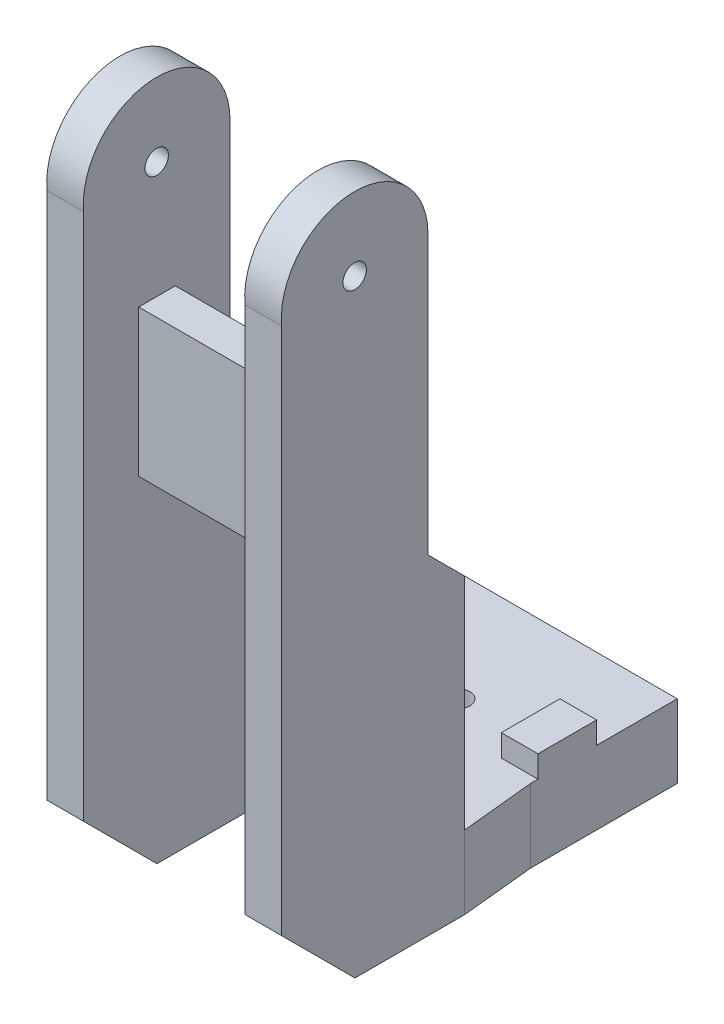
ISO-10303-21;
HEADER;
FILE_DESCRIPTION(('STEP AP214'),'2;1');
FILE_NAME('part.step','',(''),(''),'','','');
FILE_SCHEMA(('AUTOMOTIVE_DESIGN { 1 0 10303 214 1 1 1 1 }'));
ENDSEC;
DATA;
#1=APPLICATION_CONTEXT('core data for automotive mechanical design processes');
#2=APPLICATION_PROTOCOL_DEFINITION('international standard','automotive_design',2000,#1);
#3=PRODUCT_CONTEXT('',#1,'mechanical');
#4=PRODUCT('Part','Part','',(#3));
#5=PRODUCT_RELATED_PRODUCT_CATEGORY('part','',(#4));
#6=PRODUCT_DEFINITION_FORMATION('','',#4);
#7=PRODUCT_DEFINITION_CONTEXT('part definition',#1,'design');
#8=PRODUCT_DEFINITION('design','',#6,#7);
#9=PRODUCT_DEFINITION_SHAPE('','',#8);
#10=(LENGTH_UNIT() NAMED_UNIT(*) SI_UNIT(.MILLI.,.METRE.));
#11=(NAMED_UNIT(*) PLANE_ANGLE_UNIT() SI_UNIT($,.RADIAN.));
#12=(NAMED_UNIT(*) SI_UNIT($,.STERADIAN.) SOLID_ANGLE_UNIT());
#13=UNCERTAINTY_MEASURE_WITH_UNIT(LENGTH_MEASURE(1.E-05),#10,'distance_accuracy_value','');
#14=(GEOMETRIC_REPRESENTATION_CONTEXT(3) GLOBAL_UNCERTAINTY_ASSIGNED_CONTEXT((#13)) GLOBAL_UNIT_ASSIGNED_CONTEXT((#10,
#11,#12)) REPRESENTATION_CONTEXT('',''));
#15=CARTESIAN_POINT('',(0.,0.,0.));
#16=DIRECTION('',(0.,0.,1.));
#17=DIRECTION('',(1.,0.,0.));
#18=AXIS2_PLACEMENT_3D('',#15,#16,#17);
#19=CARTESIAN_POINT('',(4.,72.9195956563627,15.));
#20=DIRECTION('',(1.,0.,0.));
#21=DIRECTION('',(0.,0.,-1.));
#22=AXIS2_PLACEMENT_3D('',#19,#20,#21);
#23=PLANE('',#22);
#24=CARTESIAN_POINT('',(4.,72.9195956563627,15.));
#25=DIRECTION('',(1.,0.,0.));
#26=DIRECTION('',(0.,0.,-1.));
#27=AXIS2_PLACEMENT_3D('',#24,#25,#26);
#28=CIRCLE('',#27,1.6);
#29=CARTESIAN_POINT('',(4.,72.9195956563627,13.4));
#30=VERTEX_POINT('',#29);
#31=EDGE_CURVE('E656',#30,#30,#28,.T.);
#32=ORIENTED_EDGE('',*,*,#31,.F.);
#33=EDGE_LOOP('',(#32));
#34=FACE_BOUND('',#33,.T.);
#35=DIRECTION('',(0.,1.,0.));
#36=VECTOR('',#35,1.);
#37=CARTESIAN_POINT('',(4.,30.,0.));
#38=LINE('',#37,#36);
#39=CARTESIAN_POINT('',(4.,-10.,0.));
#40=VERTEX_POINT('',#39);
#41=CARTESIAN_POINT('',(4.,0.,0.));
#42=VERTEX_POINT('',#41);
#43=EDGE_CURVE('E276',#40,#42,#38,.T.);
#44=ORIENTED_EDGE('',*,*,#43,.T.);
#45=CARTESIAN_POINT('',(4.,30.,0.));
#46=VERTEX_POINT('',#45);
#47=EDGE_CURVE('E280',#42,#46,#38,.T.);
#48=ORIENTED_EDGE('',*,*,#47,.T.);
#49=DIRECTION('',(0.,0.707106781186547,0.707106781186548));
#50=VECTOR('',#49,1.);
#51=CARTESIAN_POINT('',(4.,35.,5.));
#52=LINE('',#51,#50);
#53=CARTESIAN_POINT('',(4.,35.,5.));
#54=VERTEX_POINT('',#53);
#55=EDGE_CURVE('E279',#46,#54,#52,.T.);
#56=ORIENTED_EDGE('',*,*,#55,.T.);
#57=DIRECTION('',(0.,1.,0.));
#58=VECTOR('',#57,1.);
#59=CARTESIAN_POINT('',(4.,72.9195956563627,5.00000000000001));
#60=LINE('',#59,#58);
#61=CARTESIAN_POINT('',(4.,72.9195956563627,5.00000000000001));
#62=VERTEX_POINT('',#61);
#63=EDGE_CURVE('E282',#54,#62,#60,.T.);
#64=ORIENTED_EDGE('',*,*,#63,.T.);
#65=CARTESIAN_POINT('',(4.,72.9195956563627,15.));
#66=DIRECTION('',(1.,0.,0.));
#67=DIRECTION('',(0.,0.,-1.));
#68=AXIS2_PLACEMENT_3D('',#65,#66,#67);
#69=CIRCLE('',#68,10.);
#70=CARTESIAN_POINT('',(4.,72.,24.9576274196617));
#71=VERTEX_POINT('',#70);
#72=EDGE_CURVE('E284',#62,#71,#69,.T.);
#73=ORIENTED_EDGE('',*,*,#72,.T.);
#74=DIRECTION('',(0.,-1.,0.));
#75=VECTOR('',#74,1.);
#76=CARTESIAN_POINT('',(4.,72.,24.9576274196617));
#77=LINE('',#76,#75);
#78=CARTESIAN_POINT('',(4.,0.,24.9576274196617));
#79=VERTEX_POINT('',#78);
#80=EDGE_CURVE('E286',#71,#79,#77,.T.);
#81=ORIENTED_EDGE('',*,*,#80,.T.);
#82=DIRECTION('',(0.,-0.707106781186548,-0.707106781186547));
#83=VECTOR('',#82,1.);
#84=CARTESIAN_POINT('',(4.,-10.,14.9576274196617));
#85=LINE('',#84,#83);
#86=CARTESIAN_POINT('',(4.,-10.,14.9576274196617));
#87=VERTEX_POINT('',#86);
#88=EDGE_CURVE('E288',#79,#87,#85,.T.);
#89=ORIENTED_EDGE('',*,*,#88,.T.);
#90=DIRECTION('',(0.,0.,-1.));
#91=VECTOR('',#90,1.);
#92=CARTESIAN_POINT('',(4.,-10.,14.9576274196617));
#93=LINE('',#92,#91);
#94=EDGE_CURVE('E290',#87,#40,#93,.T.);
#95=ORIENTED_EDGE('',*,*,#94,.T.);
#96=EDGE_LOOP('',(#44,#48,#56,#64,#73,#81,#89,#95));
#97=FACE_BOUND('',#96,.T.);
#98=DIRECTION('',(0.,0.,-1.));
#99=VECTOR('',#98,1.);
#100=CARTESIAN_POINT('',(4.,37.,17.4576274196617));
#101=LINE('',#100,#99);
#102=CARTESIAN_POINT('',(4.,37.,17.4576274196617));
#103=VERTEX_POINT('',#102);
#104=CARTESIAN_POINT('',(4.,37.,12.4576274196617));
#105=VERTEX_POINT('',#104);
#106=EDGE_CURVE('E270',#103,#105,#101,.T.);
#107=ORIENTED_EDGE('',*,*,#106,.F.);
#108=DIRECTION('',(0.,-1.,0.));
#109=VECTOR('',#108,1.);
#110=CARTESIAN_POINT('',(4.,57.,17.4576274196617));
#111=LINE('',#110,#109);
#112=CARTESIAN_POINT('',(4.,57.,17.4576274196617));
#113=VERTEX_POINT('',#112);
#114=EDGE_CURVE('E271',#113,#103,#111,.T.);
#115=ORIENTED_EDGE('',*,*,#114,.F.);
#116=DIRECTION('',(0.,0.,1.));
#117=VECTOR('',#116,1.);
#118=CARTESIAN_POINT('',(4.,57.,17.4576274196617));
#119=LINE('',#118,#117);
#120=CARTESIAN_POINT('',(4.,57.,12.4576274196617));
#121=VERTEX_POINT('',#120);
#122=EDGE_CURVE('E259',#121,#113,#119,.T.);
#123=ORIENTED_EDGE('',*,*,#122,.F.);
#124=DIRECTION('',(0.,1.,0.));
#125=VECTOR('',#124,1.);
#126=CARTESIAN_POINT('',(4.,57.,12.4576274196617));
#127=LINE('',#126,#125);
#128=EDGE_CURVE('E52',#105,#121,#127,.T.);
#129=ORIENTED_EDGE('',*,*,#128,.F.);
#130=EDGE_LOOP('',(#107,#115,#123,#129));
#131=FACE_BOUND('',#130,.T.);
#132=ADVANCED_FACE('F35',(#34,#97,#131),#23,.T.);
#133=CARTESIAN_POINT('',(26.,72.9195956563627,15.));
#134=DIRECTION('',(1.,0.,0.));
#135=DIRECTION('',(0.,0.,-1.));
#136=AXIS2_PLACEMENT_3D('',#133,#134,#135);
#137=PLANE('',#136);
#138=CARTESIAN_POINT('',(26.,72.9195956563627,15.));
#139=DIRECTION('',(1.,0.,0.));
#140=DIRECTION('',(0.,0.,-1.));
#141=AXIS2_PLACEMENT_3D('',#138,#139,#140);
#142=CIRCLE('',#141,1.6);
#143=CARTESIAN_POINT('',(26.,72.9195956563627,13.4));
#144=VERTEX_POINT('',#143);
#145=EDGE_CURVE('E275',#144,#144,#142,.T.);
#146=ORIENTED_EDGE('',*,*,#145,.T.);
#147=EDGE_LOOP('',(#146));
#148=FACE_BOUND('',#147,.T.);
#149=DIRECTION('',(0.,1.,0.));
#150=VECTOR('',#149,1.);
#151=CARTESIAN_POINT('',(26.,30.,0.));
#152=LINE('',#151,#150);
#153=CARTESIAN_POINT('',(26.,-10.,0.));
#154=VERTEX_POINT('',#153);
#155=CARTESIAN_POINT('',(26.,0.,0.));
#156=VERTEX_POINT('',#155);
#157=EDGE_CURVE('E294',#154,#156,#152,.T.);
#158=ORIENTED_EDGE('',*,*,#157,.F.);
#159=DIRECTION('',(0.,0.,-1.));
#160=VECTOR('',#159,1.);
#161=CARTESIAN_POINT('',(26.,-10.,14.9576274196617));
#162=LINE('',#161,#160);
#163=CARTESIAN_POINT('',(26.,-10.,14.9576274196617));
#164=VERTEX_POINT('',#163);
#165=EDGE_CURVE('E312',#164,#154,#162,.T.);
#166=ORIENTED_EDGE('',*,*,#165,.F.);
#167=DIRECTION('',(0.,-0.707106781186548,-0.707106781186547));
#168=VECTOR('',#167,1.);
#169=CARTESIAN_POINT('',(26.,-10.,14.9576274196617));
#170=LINE('',#169,#168);
#171=CARTESIAN_POINT('',(26.,0.,24.9576274196617));
#172=VERTEX_POINT('',#171);
#173=EDGE_CURVE('E309',#172,#164,#170,.T.);
#174=ORIENTED_EDGE('',*,*,#173,.F.);
#175=DIRECTION('',(0.,-1.,0.));
#176=VECTOR('',#175,1.);
#177=CARTESIAN_POINT('',(26.,72.,24.9576274196617));
#178=LINE('',#177,#176);
#179=CARTESIAN_POINT('',(26.,72.,24.9576274196617));
#180=VERTEX_POINT('',#179);
#181=EDGE_CURVE('E306',#180,#172,#178,.T.);
#182=ORIENTED_EDGE('',*,*,#181,.F.);
#183=CARTESIAN_POINT('',(26.,72.9195956563627,15.));
#184=DIRECTION('',(1.,0.,0.));
#185=DIRECTION('',(0.,0.,-1.));
#186=AXIS2_PLACEMENT_3D('',#183,#184,#185);
#187=CIRCLE('',#186,10.);
#188=CARTESIAN_POINT('',(26.,72.9195956563627,5.00000000000001));
#189=VERTEX_POINT('',#188);
#190=EDGE_CURVE('E303',#189,#180,#187,.T.);
#191=ORIENTED_EDGE('',*,*,#190,.F.);
#192=DIRECTION('',(0.,1.,0.));
#193=VECTOR('',#192,1.);
#194=CARTESIAN_POINT('',(26.,72.9195956563627,5.00000000000001));
#195=LINE('',#194,#193);
#196=CARTESIAN_POINT('',(26.,35.,5.));
#197=VERTEX_POINT('',#196);
#198=EDGE_CURVE('E300',#197,#189,#195,.T.);
#199=ORIENTED_EDGE('',*,*,#198,.F.);
#200=DIRECTION('',(0.,0.707106781186547,0.707106781186548));
#201=VECTOR('',#200,1.);
#202=CARTESIAN_POINT('',(26.,35.,5.));
#203=LINE('',#202,#201);
#204=CARTESIAN_POINT('',(26.,30.,0.));
#205=VERTEX_POINT('',#204);
#206=EDGE_CURVE('E297',#205,#197,#203,.T.);
#207=ORIENTED_EDGE('',*,*,#206,.F.);
#208=EDGE_CURVE('E252',#156,#205,#152,.T.);
#209=ORIENTED_EDGE('',*,*,#208,.F.);
#210=EDGE_LOOP('',(#158,#166,#174,#182,#191,#199,#207,#209));
#211=FACE_BOUND('',#210,.T.);
#212=DIRECTION('',(0.,-1.,0.));
#213=VECTOR('',#212,1.);
#214=CARTESIAN_POINT('',(26.,57.,17.4576274196617));
#215=LINE('',#214,#213);
#216=CARTESIAN_POINT('',(26.,57.,17.4576274196617));
#217=VERTEX_POINT('',#216);
#218=CARTESIAN_POINT('',(26.,37.,17.4576274196617));
#219=VERTEX_POINT('',#218);
#220=EDGE_CURVE('E60',#217,#219,#215,.T.);
#221=ORIENTED_EDGE('',*,*,#220,.T.);
#222=DIRECTION('',(0.,0.,-1.));
#223=VECTOR('',#222,1.);
#224=CARTESIAN_POINT('',(26.,37.,17.4576274196617));
#225=LINE('',#224,#223);
#226=CARTESIAN_POINT('',(26.,37.,12.4576274196617));
#227=VERTEX_POINT('',#226);
#228=EDGE_CURVE('E250',#219,#227,#225,.T.);
#229=ORIENTED_EDGE('',*,*,#228,.T.);
#230=DIRECTION('',(0.,1.,0.));
#231=VECTOR('',#230,1.);
#232=CARTESIAN_POINT('',(26.,57.,12.4576274196617));
#233=LINE('',#232,#231);
#234=CARTESIAN_POINT('',(26.,57.,12.4576274196617));
#235=VERTEX_POINT('',#234);
#236=EDGE_CURVE('E245',#227,#235,#233,.T.);
#237=ORIENTED_EDGE('',*,*,#236,.T.);
#238=DIRECTION('',(0.,0.,1.));
#239=VECTOR('',#238,1.);
#240=CARTESIAN_POINT('',(26.,57.,17.4576274196617));
#241=LINE('',#240,#239);
#242=EDGE_CURVE('E248',#235,#217,#241,.T.);
#243=ORIENTED_EDGE('',*,*,#242,.T.);
#244=EDGE_LOOP('',(#221,#229,#237,#243));
#245=FACE_BOUND('',#244,.T.);
#246=ADVANCED_FACE('F246',(#148,#211,#245),#137,.F.);
#247=CARTESIAN_POINT('',(0.,-10.,0.));
#248=DIRECTION('',(0.,1.,0.));
#249=DIRECTION('',(0.,0.,1.));
#250=AXIS2_PLACEMENT_3D('',#247,#248,#249);
#251=PLANE('',#250);
#252=CARTESIAN_POINT('',(15.,-10.,-15.));
#253=DIRECTION('',(0.,-1.,0.));
#254=DIRECTION('',(0.,0.,-1.));
#255=AXIS2_PLACEMENT_3D('',#252,#253,#254);
#256=CIRCLE('',#255,3.15);
#257=CARTESIAN_POINT('',(15.,-10.,-18.15));
#258=VERTEX_POINT('',#257);
#259=EDGE_CURVE('E382',#258,#258,#256,.T.);
#260=ORIENTED_EDGE('',*,*,#259,.F.);
#261=EDGE_LOOP('',(#260));
#262=FACE_BOUND('',#261,.T.);
#263=ORIENTED_EDGE('',*,*,#94,.F.);
#264=DIRECTION('',(-1.,0.,0.));
#265=VECTOR('',#264,1.);
#266=CARTESIAN_POINT('',(31.,-10.,14.9576274196617));
#267=LINE('',#266,#265);
#268=CARTESIAN_POINT('',(-1.,-10.,14.9576274196617));
#269=VERTEX_POINT('',#268);
#270=EDGE_CURVE('E334',#87,#269,#267,.T.);
#271=ORIENTED_EDGE('',*,*,#270,.T.);
#272=DIRECTION('',(0.,0.,-1.));
#273=VECTOR('',#272,1.);
#274=CARTESIAN_POINT('',(-1.,-10.,14.9576274196617));
#275=LINE('',#274,#273);
#276=CARTESIAN_POINT('',(-1.,-10.,0.));
#277=VERTEX_POINT('',#276);
#278=EDGE_CURVE('E322',#269,#277,#275,.T.);
#279=ORIENTED_EDGE('',*,*,#278,.T.);
#280=DIRECTION('',(-0.099503719020999,0.,0.995037190209989));
#281=VECTOR('',#280,1.);
#282=CARTESIAN_POINT('',(0.,-10.,-10.));
#283=LINE('',#282,#281);
#284=CARTESIAN_POINT('',(0.,-10.,-10.));
#285=VERTEX_POINT('',#284);
#286=EDGE_CURVE('E455',#285,#277,#283,.T.);
#287=ORIENTED_EDGE('',*,*,#286,.F.);
#288=DIRECTION('',(0.,0.,1.));
#289=VECTOR('',#288,1.);
#290=CARTESIAN_POINT('',(0.,-10.,-10.));
#291=LINE('',#290,#289);
#292=CARTESIAN_POINT('',(0.,-10.,-30.));
#293=VERTEX_POINT('',#292);
#294=EDGE_CURVE('E452',#293,#285,#291,.T.);
#295=ORIENTED_EDGE('',*,*,#294,.F.);
#296=DIRECTION('',(-1.,0.,0.));
#297=VECTOR('',#296,1.);
#298=CARTESIAN_POINT('',(0.,-10.,-30.));
#299=LINE('',#298,#297);
#300=CARTESIAN_POINT('',(30.,-10.,-30.));
#301=VERTEX_POINT('',#300);
#302=EDGE_CURVE('E449',#301,#293,#299,.T.);
#303=ORIENTED_EDGE('',*,*,#302,.F.);
#304=DIRECTION('',(0.,0.,-1.));
#305=VECTOR('',#304,1.);
#306=CARTESIAN_POINT('',(30.,-10.,-10.));
#307=LINE('',#306,#305);
#308=CARTESIAN_POINT('',(30.,-10.,-10.));
#309=VERTEX_POINT('',#308);
#310=EDGE_CURVE('E445',#309,#301,#307,.T.);
#311=ORIENTED_EDGE('',*,*,#310,.F.);
#312=DIRECTION('',(-0.099503719020999,0.,-0.995037190209989));
#313=VECTOR('',#312,1.);
#314=CARTESIAN_POINT('',(31.,-10.,0.));
#315=LINE('',#314,#313);
#316=CARTESIAN_POINT('',(31.,-10.,0.));
#317=VERTEX_POINT('',#316);
#318=EDGE_CURVE('E442',#317,#309,#315,.T.);
#319=ORIENTED_EDGE('',*,*,#318,.F.);
#320=DIRECTION('',(0.,0.,-1.));
#321=VECTOR('',#320,1.);
#322=CARTESIAN_POINT('',(31.,-10.,14.9576274196617));
#323=LINE('',#322,#321);
#324=CARTESIAN_POINT('',(31.,-10.,14.9576274196617));
#325=VERTEX_POINT('',#324);
#326=EDGE_CURVE('E332',#325,#317,#323,.T.);
#327=ORIENTED_EDGE('',*,*,#326,.F.);
#328=EDGE_CURVE('E353',#325,#164,#267,.T.);
#329=ORIENTED_EDGE('',*,*,#328,.T.);
#330=ORIENTED_EDGE('',*,*,#165,.T.);
#331=DIRECTION('',(1.,0.,0.));
#332=VECTOR('',#331,1.);
#333=CARTESIAN_POINT('',(4.,-10.,0.));
#334=LINE('',#333,#332);
#335=EDGE_CURVE('E293',#40,#154,#334,.T.);
#336=ORIENTED_EDGE('',*,*,#335,.F.);
#337=EDGE_LOOP('',(#263,#271,#279,#287,#295,#303,#311,#319,#327,#329,#330,#336));
#338=FACE_BOUND('',#337,.T.);
#339=ADVANCED_FACE('F544',(#262,#338),#251,.F.);
#340=CARTESIAN_POINT('',(31.,30.,0.));
#341=DIRECTION('',(0.,0.,1.));
#342=DIRECTION('',(0.,-1.,0.));
#343=AXIS2_PLACEMENT_3D('',#340,#341,#342);
#344=PLANE('',#343);
#345=ORIENTED_EDGE('',*,*,#47,.F.);
#346=DIRECTION('',(1.,0.,0.));
#347=VECTOR('',#346,1.);
#348=CARTESIAN_POINT('',(30.,0.,0.));
#349=LINE('',#348,#347);
#350=CARTESIAN_POINT('',(-1.,0.,0.));
#351=VERTEX_POINT('',#350);
#352=EDGE_CURVE('E458',#351,#42,#349,.T.);
#353=ORIENTED_EDGE('',*,*,#352,.F.);
#354=DIRECTION('',(0.,1.,0.));
#355=VECTOR('',#354,1.);
#356=CARTESIAN_POINT('',(-1.,30.,0.));
#357=LINE('',#356,#355);
#358=CARTESIAN_POINT('',(-1.,30.,0.));
#359=VERTEX_POINT('',#358);
#360=EDGE_CURVE('E318',#351,#359,#357,.T.);
#361=ORIENTED_EDGE('',*,*,#360,.T.);
#362=DIRECTION('',(-1.,0.,0.));
#363=VECTOR('',#362,1.);
#364=CARTESIAN_POINT('',(31.,30.,0.));
#365=LINE('',#364,#363);
#366=EDGE_CURVE('E372',#46,#359,#365,.T.);
#367=ORIENTED_EDGE('',*,*,#366,.F.);
#368=EDGE_LOOP('',(#345,#353,#361,#367));
#369=FACE_BOUND('',#368,.T.);
#370=ADVANCED_FACE('F516',(#369),#344,.F.);
#371=CARTESIAN_POINT('',(31.,35.,5.));
#372=DIRECTION('',(0.,-0.707106781186548,0.707106781186547));
#373=DIRECTION('',(0.,-0.707106781186547,-0.707106781186548));
#374=AXIS2_PLACEMENT_3D('',#371,#372,#373);
#375=PLANE('',#374);
#376=ORIENTED_EDGE('',*,*,#55,.F.);
#377=ORIENTED_EDGE('',*,*,#366,.T.);
#378=DIRECTION('',(0.,0.707106781186547,0.707106781186548));
#379=VECTOR('',#378,1.);
#380=CARTESIAN_POINT('',(-1.,35.,5.));
#381=LINE('',#380,#379);
#382=CARTESIAN_POINT('',(-1.,35.,5.));
#383=VERTEX_POINT('',#382);
#384=EDGE_CURVE('E337',#359,#383,#381,.T.);
#385=ORIENTED_EDGE('',*,*,#384,.T.);
#386=DIRECTION('',(-1.,0.,0.));
#387=VECTOR('',#386,1.);
#388=CARTESIAN_POINT('',(31.,35.,5.));
#389=LINE('',#388,#387);
#390=EDGE_CURVE('E368',#54,#383,#389,.T.);
#391=ORIENTED_EDGE('',*,*,#390,.F.);
#392=EDGE_LOOP('',(#376,#377,#385,#391));
#393=FACE_BOUND('',#392,.T.);
#394=ADVANCED_FACE('F520',(#393),#375,.F.);
#395=CARTESIAN_POINT('',(31.,72.9195956563627,5.00000000000001));
#396=DIRECTION('',(0.,0.,1.));
#397=DIRECTION('',(0.,-1.,0.));
#398=AXIS2_PLACEMENT_3D('',#395,#396,#397);
#399=PLANE('',#398);
#400=ORIENTED_EDGE('',*,*,#63,.F.);
#401=ORIENTED_EDGE('',*,*,#390,.T.);
#402=DIRECTION('',(0.,1.,0.));
#403=VECTOR('',#402,1.);
#404=CARTESIAN_POINT('',(-1.,72.9195956563627,5.00000000000001));
#405=LINE('',#404,#403);
#406=CARTESIAN_POINT('',(-1.,72.9195956563627,5.00000000000001));
#407=VERTEX_POINT('',#406);
#408=EDGE_CURVE('E340',#383,#407,#405,.T.);
#409=ORIENTED_EDGE('',*,*,#408,.T.);
#410=DIRECTION('',(-1.,0.,0.));
#411=VECTOR('',#410,1.);
#412=CARTESIAN_POINT('',(31.,72.9195956563627,5.00000000000001));
#413=LINE('',#412,#411);
#414=EDGE_CURVE('E364',#62,#407,#413,.T.);
#415=ORIENTED_EDGE('',*,*,#414,.F.);
#416=EDGE_LOOP('',(#400,#401,#409,#415));
#417=FACE_BOUND('',#416,.T.);
#418=ADVANCED_FACE('F527',(#417),#399,.F.);
#419=CARTESIAN_POINT('',(31.,72.9195956563627,15.));
#420=DIRECTION('',(-1.,0.,0.));
#421=DIRECTION('',(0.,0.,1.));
#422=AXIS2_PLACEMENT_3D('',#419,#420,#421);
#423=CYLINDRICAL_SURFACE('',#422,10.);
#424=ORIENTED_EDGE('',*,*,#72,.F.);
#425=ORIENTED_EDGE('',*,*,#414,.T.);
#426=CARTESIAN_POINT('',(-1.,72.9195956563627,15.));
#427=DIRECTION('',(1.,0.,0.));
#428=DIRECTION('',(0.,0.,-1.));
#429=AXIS2_PLACEMENT_3D('',#426,#427,#428);
#430=CIRCLE('',#429,10.);
#431=CARTESIAN_POINT('',(-1.,72.,24.9576274196617));
#432=VERTEX_POINT('',#431);
#433=EDGE_CURVE('E343',#407,#432,#430,.T.);
#434=ORIENTED_EDGE('',*,*,#433,.T.);
#435=DIRECTION('',(-1.,0.,0.));
#436=VECTOR('',#435,1.);
#437=CARTESIAN_POINT('',(31.,72.,24.9576274196617));
#438=LINE('',#437,#436);
#439=EDGE_CURVE('E360',#71,#432,#438,.T.);
#440=ORIENTED_EDGE('',*,*,#439,.F.);
#441=EDGE_LOOP('',(#424,#425,#434,#440));
#442=FACE_BOUND('',#441,.T.);
#443=ADVANCED_FACE('F530',(#442),#423,.T.);
#444=CARTESIAN_POINT('',(31.,72.,24.9576274196617));
#445=DIRECTION('',(0.,0.,-1.));
#446=DIRECTION('',(0.,1.,0.));
#447=AXIS2_PLACEMENT_3D('',#444,#445,#446);
#448=PLANE('',#447);
#449=ORIENTED_EDGE('',*,*,#80,.F.);
#450=ORIENTED_EDGE('',*,*,#439,.T.);
#451=DIRECTION('',(0.,-1.,0.));
#452=VECTOR('',#451,1.);
#453=CARTESIAN_POINT('',(-1.,72.,24.9576274196617));
#454=LINE('',#453,#452);
#455=CARTESIAN_POINT('',(-1.,0.,24.9576274196617));
#456=VERTEX_POINT('',#455);
#457=EDGE_CURVE('E346',#432,#456,#454,.T.);
#458=ORIENTED_EDGE('',*,*,#457,.T.);
#459=DIRECTION('',(-1.,0.,0.));
#460=VECTOR('',#459,1.);
#461=CARTESIAN_POINT('',(31.,0.,24.9576274196617));
#462=LINE('',#461,#460);
#463=EDGE_CURVE('E356',#79,#456,#462,.T.);
#464=ORIENTED_EDGE('',*,*,#463,.F.);
#465=EDGE_LOOP('',(#449,#450,#458,#464));
#466=FACE_BOUND('',#465,.T.);
#467=ADVANCED_FACE('F537',(#466),#448,.F.);
#468=CARTESIAN_POINT('',(31.,-10.,14.9576274196617));
#469=DIRECTION('',(0.,0.707106781186547,-0.707106781186548));
#470=DIRECTION('',(0.,0.707106781186548,0.707106781186547));
#471=AXIS2_PLACEMENT_3D('',#468,#469,#470);
#472=PLANE('',#471);
#473=ORIENTED_EDGE('',*,*,#88,.F.);
#474=ORIENTED_EDGE('',*,*,#463,.T.);
#475=DIRECTION('',(0.,-0.707106781186548,-0.707106781186547));
#476=VECTOR('',#475,1.);
#477=CARTESIAN_POINT('',(-1.,-10.,14.9576274196617));
#478=LINE('',#477,#476);
#479=EDGE_CURVE('E349',#456,#269,#478,.T.);
#480=ORIENTED_EDGE('',*,*,#479,.T.);
#481=ORIENTED_EDGE('',*,*,#270,.F.);
#482=EDGE_LOOP('',(#473,#474,#480,#481));
#483=FACE_BOUND('',#482,.T.);
#484=ADVANCED_FACE('F540',(#483),#472,.F.);
#485=CARTESIAN_POINT('',(0.,0.,0.));
#486=DIRECTION('',(0.,1.,0.));
#487=DIRECTION('',(0.,0.,1.));
#488=AXIS2_PLACEMENT_3D('',#485,#486,#487);
#489=PLANE('',#488);
#490=DIRECTION('',(0.,0.,1.));
#491=VECTOR('',#490,1.);
#492=CARTESIAN_POINT('',(25.,0.,-19.));
#493=LINE('',#492,#491);
#494=CARTESIAN_POINT('',(25.,0.,-19.));
#495=VERTEX_POINT('',#494);
#496=CARTESIAN_POINT('',(25.,0.,-11.));
#497=VERTEX_POINT('',#496);
#498=EDGE_CURVE('E398',#495,#497,#493,.T.);
#499=ORIENTED_EDGE('',*,*,#498,.F.);
#500=DIRECTION('',(-1.,0.,0.));
#501=VECTOR('',#500,1.);
#502=CARTESIAN_POINT('',(30.,0.,-19.));
#503=LINE('',#502,#501);
#504=CARTESIAN_POINT('',(30.,0.,-19.));
#505=VERTEX_POINT('',#504);
#506=EDGE_CURVE('E385',#505,#495,#503,.T.);
#507=ORIENTED_EDGE('',*,*,#506,.F.);
#508=DIRECTION('',(0.,0.,-1.));
#509=VECTOR('',#508,1.);
#510=CARTESIAN_POINT('',(30.,0.,-10.));
#511=LINE('',#510,#509);
#512=CARTESIAN_POINT('',(30.,0.,-30.));
#513=VERTEX_POINT('',#512);
#514=EDGE_CURVE('E464',#505,#513,#511,.T.);
#515=ORIENTED_EDGE('',*,*,#514,.T.);
#516=DIRECTION('',(-1.,0.,0.));
#517=VECTOR('',#516,1.);
#518=CARTESIAN_POINT('',(0.,0.,-30.));
#519=LINE('',#518,#517);
#520=CARTESIAN_POINT('',(0.,0.,-30.));
#521=VERTEX_POINT('',#520);
#522=EDGE_CURVE('E468',#513,#521,#519,.T.);
#523=ORIENTED_EDGE('',*,*,#522,.T.);
#524=DIRECTION('',(0.,0.,1.));
#525=VECTOR('',#524,1.);
#526=CARTESIAN_POINT('',(0.,0.,-10.));
#527=LINE('',#526,#525);
#528=CARTESIAN_POINT('',(0.,0.,-19.));
#529=VERTEX_POINT('',#528);
#530=EDGE_CURVE('E472',#521,#529,#527,.T.);
#531=ORIENTED_EDGE('',*,*,#530,.T.);
#532=DIRECTION('',(-1.,0.,0.));
#533=VECTOR('',#532,1.);
#534=CARTESIAN_POINT('',(0.,0.,-19.));
#535=LINE('',#534,#533);
#536=CARTESIAN_POINT('',(5.,0.,-19.));
#537=VERTEX_POINT('',#536);
#538=EDGE_CURVE('E416',#537,#529,#535,.T.);
#539=ORIENTED_EDGE('',*,*,#538,.F.);
#540=DIRECTION('',(0.,0.,-1.));
#541=VECTOR('',#540,1.);
#542=CARTESIAN_POINT('',(5.,0.,-19.));
#543=LINE('',#542,#541);
#544=CARTESIAN_POINT('',(5.,0.,-11.));
#545=VERTEX_POINT('',#544);
#546=EDGE_CURVE('E425',#545,#537,#543,.T.);
#547=ORIENTED_EDGE('',*,*,#546,.F.);
#548=DIRECTION('',(1.,0.,0.));
#549=VECTOR('',#548,1.);
#550=CARTESIAN_POINT('',(0.,0.,-11.));
#551=LINE('',#550,#549);
#552=CARTESIAN_POINT('',(0.,0.,-11.));
#553=VERTEX_POINT('',#552);
#554=EDGE_CURVE('E411',#553,#545,#551,.T.);
#555=ORIENTED_EDGE('',*,*,#554,.F.);
#556=CARTESIAN_POINT('',(0.,0.,-10.));
#557=VERTEX_POINT('',#556);
#558=EDGE_CURVE('E471',#553,#557,#527,.T.);
#559=ORIENTED_EDGE('',*,*,#558,.T.);
#560=DIRECTION('',(-0.099503719020999,0.,0.995037190209989));
#561=VECTOR('',#560,1.);
#562=CARTESIAN_POINT('',(0.,0.,-10.));
#563=LINE('',#562,#561);
#564=EDGE_CURVE('E446',#557,#351,#563,.T.);
#565=ORIENTED_EDGE('',*,*,#564,.T.);
#566=ORIENTED_EDGE('',*,*,#352,.T.);
#567=DIRECTION('',(-1.,0.,0.));
#568=VECTOR('',#567,1.);
#569=CARTESIAN_POINT('',(0.,0.,0.));
#570=LINE('',#569,#568);
#571=EDGE_CURVE('E316',#156,#42,#570,.T.);
#572=ORIENTED_EDGE('',*,*,#571,.F.);
#573=CARTESIAN_POINT('',(31.,0.,0.));
#574=VERTEX_POINT('',#573);
#575=EDGE_CURVE('E441',#156,#574,#349,.T.);
#576=ORIENTED_EDGE('',*,*,#575,.T.);
#577=DIRECTION('',(-0.099503719020999,0.,-0.995037190209989));
#578=VECTOR('',#577,1.);
#579=CARTESIAN_POINT('',(31.,0.,0.));
#580=LINE('',#579,#578);
#581=CARTESIAN_POINT('',(30.,0.,-10.));
#582=VERTEX_POINT('',#581);
#583=EDGE_CURVE('E461',#574,#582,#580,.T.);
#584=ORIENTED_EDGE('',*,*,#583,.T.);
#585=CARTESIAN_POINT('',(30.,0.,-11.));
#586=VERTEX_POINT('',#585);
#587=EDGE_CURVE('E465',#582,#586,#511,.T.);
#588=ORIENTED_EDGE('',*,*,#587,.T.);
#589=DIRECTION('',(1.,0.,0.));
#590=VECTOR('',#589,1.);
#591=CARTESIAN_POINT('',(30.,0.,-11.));
#592=LINE('',#591,#590);
#593=EDGE_CURVE('E390',#497,#586,#592,.T.);
#594=ORIENTED_EDGE('',*,*,#593,.F.);
#595=EDGE_LOOP('',(#499,#507,#515,#523,#531,#539,#547,#555,#559,#565,#566,#572,#576,#584,#588,#594));
#596=FACE_BOUND('',#595,.T.);
#597=CARTESIAN_POINT('',(15.,0.,-15.));
#598=DIRECTION('',(0.,-1.,0.));
#599=DIRECTION('',(0.,0.,-1.));
#600=AXIS2_PLACEMENT_3D('',#597,#598,#599);
#601=CIRCLE('',#600,1.7);
#602=CARTESIAN_POINT('',(15.,0.,-16.7));
#603=VERTEX_POINT('',#602);
#604=EDGE_CURVE('E376',#603,#603,#601,.T.);
#605=ORIENTED_EDGE('',*,*,#604,.T.);
#606=EDGE_LOOP('',(#605));
#607=FACE_BOUND('',#606,.T.);
#608=ADVANCED_FACE('F502',(#596,#607),#489,.T.);
#609=CARTESIAN_POINT('',(0.,-10.,-10.));
#610=DIRECTION('',(-0.995037190209989,0.,-0.099503719020999));
#611=DIRECTION('',(-0.099503719020999,0.,0.995037190209989));
#612=AXIS2_PLACEMENT_3D('',#609,#610,#611);
#613=PLANE('',#612);
#614=ORIENTED_EDGE('',*,*,#564,.F.);
#615=DIRECTION('',(0.,1.,0.));
#616=VECTOR('',#615,1.);
#617=CARTESIAN_POINT('',(0.,-10.,-10.));
#618=LINE('',#617,#616);
#619=EDGE_CURVE('E44',#285,#557,#618,.T.);
#620=ORIENTED_EDGE('',*,*,#619,.F.);
#621=ORIENTED_EDGE('',*,*,#286,.T.);
#622=DIRECTION('',(0.,1.,0.));
#623=VECTOR('',#622,1.);
#624=CARTESIAN_POINT('',(-1.,-10.,0.));
#625=LINE('',#624,#623);
#626=EDGE_CURVE('E11',#277,#351,#625,.T.);
#627=ORIENTED_EDGE('',*,*,#626,.T.);
#628=EDGE_LOOP('',(#614,#620,#621,#627));
#629=FACE_BOUND('',#628,.T.);
#630=ADVANCED_FACE('F608',(#629),#613,.T.);
#631=CARTESIAN_POINT('',(0.,-10.,-10.));
#632=DIRECTION('',(-1.,0.,0.));
#633=DIRECTION('',(0.,0.,1.));
#634=AXIS2_PLACEMENT_3D('',#631,#632,#633);
#635=PLANE('',#634);
#636=ORIENTED_EDGE('',*,*,#530,.F.);
#637=DIRECTION('',(0.,1.,0.));
#638=VECTOR('',#637,1.);
#639=CARTESIAN_POINT('',(0.,-10.,-30.));
#640=LINE('',#639,#638);
#641=EDGE_CURVE('E478',#293,#521,#640,.T.);
#642=ORIENTED_EDGE('',*,*,#641,.F.);
#643=ORIENTED_EDGE('',*,*,#294,.T.);
#644=ORIENTED_EDGE('',*,*,#619,.T.);
#645=ORIENTED_EDGE('',*,*,#558,.F.);
#646=DIRECTION('',(0.,-1.,0.));
#647=VECTOR('',#646,1.);
#648=CARTESIAN_POINT('',(0.,3.,-11.));
#649=LINE('',#648,#647);
#650=CARTESIAN_POINT('',(0.,3.,-11.));
#651=VERTEX_POINT('',#650);
#652=EDGE_CURVE('E438',#651,#553,#649,.T.);
#653=ORIENTED_EDGE('',*,*,#652,.F.);
#654=DIRECTION('',(0.,0.,1.));
#655=VECTOR('',#654,1.);
#656=CARTESIAN_POINT('',(0.,3.,-19.));
#657=LINE('',#656,#655);
#658=CARTESIAN_POINT('',(0.,3.,-19.));
#659=VERTEX_POINT('',#658);
#660=EDGE_CURVE('E412',#659,#651,#657,.T.);
#661=ORIENTED_EDGE('',*,*,#660,.F.);
#662=DIRECTION('',(0.,-1.,0.));
#663=VECTOR('',#662,1.);
#664=CARTESIAN_POINT('',(0.,3.,-19.));
#665=LINE('',#664,#663);
#666=EDGE_CURVE('E422',#659,#529,#665,.T.);
#667=ORIENTED_EDGE('',*,*,#666,.T.);
#668=EDGE_LOOP('',(#636,#642,#643,#644,#645,#653,#661,#667));
#669=FACE_BOUND('',#668,.T.);
#670=ADVANCED_FACE('F590',(#669),#635,.T.);
#671=CARTESIAN_POINT('',(0.,-10.,-30.));
#672=DIRECTION('',(0.,0.,-1.));
#673=DIRECTION('',(-1.,0.,0.));
#674=AXIS2_PLACEMENT_3D('',#671,#672,#673);
#675=PLANE('',#674);
#676=ORIENTED_EDGE('',*,*,#522,.F.);
#677=DIRECTION('',(0.,1.,0.));
#678=VECTOR('',#677,1.);
#679=CARTESIAN_POINT('',(30.,-10.,-30.));
#680=LINE('',#679,#678);
#681=EDGE_CURVE('E480',#301,#513,#680,.T.);
#682=ORIENTED_EDGE('',*,*,#681,.F.);
#683=ORIENTED_EDGE('',*,*,#302,.T.);
#684=ORIENTED_EDGE('',*,*,#641,.T.);
#685=EDGE_LOOP('',(#676,#682,#683,#684));
#686=FACE_BOUND('',#685,.T.);
#687=ADVANCED_FACE('F588',(#686),#675,.T.);
#688=CARTESIAN_POINT('',(30.,-10.,-10.));
#689=DIRECTION('',(1.,0.,0.));
#690=DIRECTION('',(0.,0.,-1.));
#691=AXIS2_PLACEMENT_3D('',#688,#689,#690);
#692=PLANE('',#691);
#693=ORIENTED_EDGE('',*,*,#587,.F.);
#694=DIRECTION('',(0.,1.,0.));
#695=VECTOR('',#694,1.);
#696=CARTESIAN_POINT('',(30.,-10.,-10.));
#697=LINE('',#696,#695);
#698=EDGE_CURVE('E482',#309,#582,#697,.T.);
#699=ORIENTED_EDGE('',*,*,#698,.F.);
#700=ORIENTED_EDGE('',*,*,#310,.T.);
#701=ORIENTED_EDGE('',*,*,#681,.T.);
#702=ORIENTED_EDGE('',*,*,#514,.F.);
#703=DIRECTION('',(0.,-1.,0.));
#704=VECTOR('',#703,1.);
#705=CARTESIAN_POINT('',(30.,3.,-19.));
#706=LINE('',#705,#704);
#707=CARTESIAN_POINT('',(30.,3.,-19.));
#708=VERTEX_POINT('',#707);
#709=EDGE_CURVE('E409',#708,#505,#706,.T.);
#710=ORIENTED_EDGE('',*,*,#709,.F.);
#711=DIRECTION('',(0.,0.,-1.));
#712=VECTOR('',#711,1.);
#713=CARTESIAN_POINT('',(30.,3.,-19.));
#714=LINE('',#713,#712);
#715=CARTESIAN_POINT('',(30.,3.,-11.));
#716=VERTEX_POINT('',#715);
#717=EDGE_CURVE('E386',#716,#708,#714,.T.);
#718=ORIENTED_EDGE('',*,*,#717,.F.);
#719=DIRECTION('',(0.,-1.,0.));
#720=VECTOR('',#719,1.);
#721=CARTESIAN_POINT('',(30.,3.,-11.));
#722=LINE('',#721,#720);
#723=EDGE_CURVE('E396',#716,#586,#722,.T.);
#724=ORIENTED_EDGE('',*,*,#723,.T.);
#725=EDGE_LOOP('',(#693,#699,#700,#701,#702,#710,#718,#724));
#726=FACE_BOUND('',#725,.T.);
#727=ADVANCED_FACE('F569',(#726),#692,.T.);
#728=CARTESIAN_POINT('',(31.,-10.,0.));
#729=DIRECTION('',(0.995037190209989,0.,-0.099503719020999));
#730=DIRECTION('',(-0.099503719020999,0.,-0.995037190209989));
#731=AXIS2_PLACEMENT_3D('',#728,#729,#730);
#732=PLANE('',#731);
#733=ORIENTED_EDGE('',*,*,#583,.F.);
#734=DIRECTION('',(0.,1.,0.));
#735=VECTOR('',#734,1.);
#736=CARTESIAN_POINT('',(31.,-10.,0.));
#737=LINE('',#736,#735);
#738=EDGE_CURVE('E39',#317,#574,#737,.T.);
#739=ORIENTED_EDGE('',*,*,#738,.F.);
#740=ORIENTED_EDGE('',*,*,#318,.T.);
#741=ORIENTED_EDGE('',*,*,#698,.T.);
#742=EDGE_LOOP('',(#733,#739,#740,#741));
#743=FACE_BOUND('',#742,.T.);
#744=ADVANCED_FACE('F37',(#743),#732,.T.);
#745=CARTESIAN_POINT('',(0.,3.,-11.));
#746=DIRECTION('',(0.,0.,-1.));
#747=DIRECTION('',(-1.,0.,0.));
#748=AXIS2_PLACEMENT_3D('',#745,#746,#747);
#749=PLANE('',#748);
#750=ORIENTED_EDGE('',*,*,#554,.T.);
#751=DIRECTION('',(0.,-1.,0.));
#752=VECTOR('',#751,1.);
#753=CARTESIAN_POINT('',(5.,3.,-11.));
#754=LINE('',#753,#752);
#755=CARTESIAN_POINT('',(5.,3.,-11.));
#756=VERTEX_POINT('',#755);
#757=EDGE_CURVE('E435',#756,#545,#754,.T.);
#758=ORIENTED_EDGE('',*,*,#757,.F.);
#759=DIRECTION('',(1.,0.,0.));
#760=VECTOR('',#759,1.);
#761=CARTESIAN_POINT('',(0.,3.,-11.));
#762=LINE('',#761,#760);
#763=EDGE_CURVE('E415',#651,#756,#762,.T.);
#764=ORIENTED_EDGE('',*,*,#763,.F.);
#765=ORIENTED_EDGE('',*,*,#652,.T.);
#766=EDGE_LOOP('',(#750,#758,#764,#765));
#767=FACE_BOUND('',#766,.T.);
#768=ADVANCED_FACE('F603',(#767),#749,.F.);
#769=CARTESIAN_POINT('',(5.,3.,-19.));
#770=DIRECTION('',(-1.,0.,0.));
#771=DIRECTION('',(0.,0.,1.));
#772=AXIS2_PLACEMENT_3D('',#769,#770,#771);
#773=PLANE('',#772);
#774=ORIENTED_EDGE('',*,*,#546,.T.);
#775=DIRECTION('',(0.,-1.,0.));
#776=VECTOR('',#775,1.);
#777=CARTESIAN_POINT('',(5.,3.,-19.));
#778=LINE('',#777,#776);
#779=CARTESIAN_POINT('',(5.,3.,-19.));
#780=VERTEX_POINT('',#779);
#781=EDGE_CURVE('E432',#780,#537,#778,.T.);
#782=ORIENTED_EDGE('',*,*,#781,.F.);
#783=DIRECTION('',(0.,0.,-1.));
#784=VECTOR('',#783,1.);
#785=CARTESIAN_POINT('',(5.,3.,-19.));
#786=LINE('',#785,#784);
#787=EDGE_CURVE('E418',#756,#780,#786,.T.);
#788=ORIENTED_EDGE('',*,*,#787,.F.);
#789=ORIENTED_EDGE('',*,*,#757,.T.);
#790=EDGE_LOOP('',(#774,#782,#788,#789));
#791=FACE_BOUND('',#790,.T.);
#792=ADVANCED_FACE('F599',(#791),#773,.F.);
#793=CARTESIAN_POINT('',(0.,3.,-19.));
#794=DIRECTION('',(0.,0.,1.));
#795=DIRECTION('',(1.,0.,0.));
#796=AXIS2_PLACEMENT_3D('',#793,#794,#795);
#797=PLANE('',#796);
#798=ORIENTED_EDGE('',*,*,#538,.T.);
#799=ORIENTED_EDGE('',*,*,#666,.F.);
#800=DIRECTION('',(-1.,0.,0.));
#801=VECTOR('',#800,1.);
#802=CARTESIAN_POINT('',(0.,3.,-19.));
#803=LINE('',#802,#801);
#804=EDGE_CURVE('E420',#780,#659,#803,.T.);
#805=ORIENTED_EDGE('',*,*,#804,.F.);
#806=ORIENTED_EDGE('',*,*,#781,.T.);
#807=EDGE_LOOP('',(#798,#799,#805,#806));
#808=FACE_BOUND('',#807,.T.);
#809=ADVANCED_FACE('F596',(#808),#797,.F.);
#810=CARTESIAN_POINT('',(0.,3.,0.));
#811=DIRECTION('',(0.,1.,0.));
#812=DIRECTION('',(0.,0.,1.));
#813=AXIS2_PLACEMENT_3D('',#810,#811,#812);
#814=PLANE('',#813);
#815=ORIENTED_EDGE('',*,*,#660,.T.);
#816=ORIENTED_EDGE('',*,*,#763,.T.);
#817=ORIENTED_EDGE('',*,*,#787,.T.);
#818=ORIENTED_EDGE('',*,*,#804,.T.);
#819=EDGE_LOOP('',(#815,#816,#817,#818));
#820=FACE_BOUND('',#819,.T.);
#821=ADVANCED_FACE('F916',(#820),#814,.T.);
#822=CARTESIAN_POINT('',(30.,3.,-19.));
#823=DIRECTION('',(0.,0.,1.));
#824=DIRECTION('',(1.,0.,0.));
#825=AXIS2_PLACEMENT_3D('',#822,#823,#824);
#826=PLANE('',#825);
#827=ORIENTED_EDGE('',*,*,#506,.T.);
#828=DIRECTION('',(0.,-1.,0.));
#829=VECTOR('',#828,1.);
#830=CARTESIAN_POINT('',(25.,3.,-19.));
#831=LINE('',#830,#829);
#832=CARTESIAN_POINT('',(25.,3.,-19.));
#833=VERTEX_POINT('',#832);
#834=EDGE_CURVE('E406',#833,#495,#831,.T.);
#835=ORIENTED_EDGE('',*,*,#834,.F.);
#836=DIRECTION('',(-1.,0.,0.));
#837=VECTOR('',#836,1.);
#838=CARTESIAN_POINT('',(30.,3.,-19.));
#839=LINE('',#838,#837);
#840=EDGE_CURVE('E389',#708,#833,#839,.T.);
#841=ORIENTED_EDGE('',*,*,#840,.F.);
#842=ORIENTED_EDGE('',*,*,#709,.T.);
#843=EDGE_LOOP('',(#827,#835,#841,#842));
#844=FACE_BOUND('',#843,.T.);
#845=ADVANCED_FACE('F585',(#844),#826,.F.);
#846=CARTESIAN_POINT('',(25.,3.,-19.));
#847=DIRECTION('',(1.,0.,0.));
#848=DIRECTION('',(0.,0.,-1.));
#849=AXIS2_PLACEMENT_3D('',#846,#847,#848);
#850=PLANE('',#849);
#851=ORIENTED_EDGE('',*,*,#498,.T.);
#852=DIRECTION('',(0.,-1.,0.));
#853=VECTOR('',#852,1.);
#854=CARTESIAN_POINT('',(25.,3.,-11.));
#855=LINE('',#854,#853);
#856=CARTESIAN_POINT('',(25.,3.,-11.));
#857=VERTEX_POINT('',#856);
#858=EDGE_CURVE('E404',#857,#497,#855,.T.);
#859=ORIENTED_EDGE('',*,*,#858,.F.);
#860=DIRECTION('',(0.,0.,1.));
#861=VECTOR('',#860,1.);
#862=CARTESIAN_POINT('',(25.,3.,-19.));
#863=LINE('',#862,#861);
#864=EDGE_CURVE('E392',#833,#857,#863,.T.);
#865=ORIENTED_EDGE('',*,*,#864,.F.);
#866=ORIENTED_EDGE('',*,*,#834,.T.);
#867=EDGE_LOOP('',(#851,#859,#865,#866));
#868=FACE_BOUND('',#867,.T.);
#869=ADVANCED_FACE('F581',(#868),#850,.F.);
#870=CARTESIAN_POINT('',(30.,3.,-11.));
#871=DIRECTION('',(0.,0.,-1.));
#872=DIRECTION('',(-1.,0.,0.));
#873=AXIS2_PLACEMENT_3D('',#870,#871,#872);
#874=PLANE('',#873);
#875=ORIENTED_EDGE('',*,*,#593,.T.);
#876=ORIENTED_EDGE('',*,*,#723,.F.);
#877=DIRECTION('',(1.,0.,0.));
#878=VECTOR('',#877,1.);
#879=CARTESIAN_POINT('',(30.,3.,-11.));
#880=LINE('',#879,#878);
#881=EDGE_CURVE('E394',#857,#716,#880,.T.);
#882=ORIENTED_EDGE('',*,*,#881,.F.);
#883=ORIENTED_EDGE('',*,*,#858,.T.);
#884=EDGE_LOOP('',(#875,#876,#882,#883));
#885=FACE_BOUND('',#884,.T.);
#886=ADVANCED_FACE('F577',(#885),#874,.F.);
#887=CARTESIAN_POINT('',(0.,3.,0.));
#888=DIRECTION('',(0.,-1.,0.));
#889=DIRECTION('',(0.,0.,-1.));
#890=AXIS2_PLACEMENT_3D('',#887,#888,#889);
#891=PLANE('',#890);
#892=ORIENTED_EDGE('',*,*,#717,.T.);
#893=ORIENTED_EDGE('',*,*,#840,.T.);
#894=ORIENTED_EDGE('',*,*,#864,.T.);
#895=ORIENTED_EDGE('',*,*,#881,.T.);
#896=EDGE_LOOP('',(#892,#893,#894,#895));
#897=FACE_BOUND('',#896,.T.);
#898=ADVANCED_FACE('F882',(#897),#891,.F.);
#899=CARTESIAN_POINT('',(15.,-10.,-15.));
#900=DIRECTION('',(0.,-1.,0.));
#901=DIRECTION('',(0.,0.,-1.));
#902=AXIS2_PLACEMENT_3D('',#899,#900,#901);
#903=CONICAL_SURFACE('',#902,3.15,0.785398163397448);
#904=CARTESIAN_POINT('',(15.,-8.55,-15.));
#905=DIRECTION('',(0.,-1.,0.));
#906=DIRECTION('',(0.,0.,-1.));
#907=AXIS2_PLACEMENT_3D('',#904,#905,#906);
#908=CIRCLE('',#907,1.7);
#909=CARTESIAN_POINT('',(15.,-8.55,-16.7));
#910=VERTEX_POINT('',#909);
#911=EDGE_CURVE('E379',#910,#910,#908,.T.);
#912=ORIENTED_EDGE('',*,*,#911,.F.);
#913=EDGE_LOOP('',(#912));
#914=FACE_BOUND('',#913,.T.);
#915=ORIENTED_EDGE('',*,*,#259,.T.);
#916=EDGE_LOOP('',(#915));
#917=FACE_BOUND('',#916,.T.);
#918=ADVANCED_FACE('F873',(#914,#917),#903,.F.);
#919=CARTESIAN_POINT('',(15.,-10.,-15.));
#920=DIRECTION('',(0.,-1.,0.));
#921=DIRECTION('',(0.,0.,-1.));
#922=AXIS2_PLACEMENT_3D('',#919,#920,#921);
#923=CYLINDRICAL_SURFACE('',#922,1.7);
#924=ORIENTED_EDGE('',*,*,#604,.F.);
#925=EDGE_LOOP('',(#924));
#926=FACE_BOUND('',#925,.T.);
#927=ORIENTED_EDGE('',*,*,#911,.T.);
#928=EDGE_LOOP('',(#927));
#929=FACE_BOUND('',#928,.T.);
#930=ADVANCED_FACE('F784',(#926,#929),#923,.F.);
#931=ORIENTED_EDGE('',*,*,#575,.F.);
#932=ORIENTED_EDGE('',*,*,#208,.T.);
#933=CARTESIAN_POINT('',(31.,30.,0.));
#934=VERTEX_POINT('',#933);
#935=EDGE_CURVE('E373',#934,#205,#365,.T.);
#936=ORIENTED_EDGE('',*,*,#935,.F.);
#937=DIRECTION('',(0.,1.,0.));
#938=VECTOR('',#937,1.);
#939=CARTESIAN_POINT('',(31.,30.,0.));
#940=LINE('',#939,#938);
#941=EDGE_CURVE('E319',#574,#934,#940,.T.);
#942=ORIENTED_EDGE('',*,*,#941,.F.);
#943=EDGE_LOOP('',(#931,#932,#936,#942));
#944=FACE_BOUND('',#943,.T.);
#945=ADVANCED_FACE('F497',(#944),#344,.F.);
#946=ORIENTED_EDGE('',*,*,#935,.T.);
#947=ORIENTED_EDGE('',*,*,#206,.T.);
#948=CARTESIAN_POINT('',(31.,35.,5.));
#949=VERTEX_POINT('',#948);
#950=EDGE_CURVE('E369',#949,#197,#389,.T.);
#951=ORIENTED_EDGE('',*,*,#950,.F.);
#952=DIRECTION('',(0.,0.707106781186547,0.707106781186548));
#953=VECTOR('',#952,1.);
#954=CARTESIAN_POINT('',(31.,35.,5.));
#955=LINE('',#954,#953);
#956=EDGE_CURVE('E321',#934,#949,#955,.T.);
#957=ORIENTED_EDGE('',*,*,#956,.F.);
#958=EDGE_LOOP('',(#946,#947,#951,#957));
#959=FACE_BOUND('',#958,.T.);
#960=ADVANCED_FACE('F547',(#959),#375,.F.);
#961=ORIENTED_EDGE('',*,*,#950,.T.);
#962=ORIENTED_EDGE('',*,*,#198,.T.);
#963=CARTESIAN_POINT('',(31.,72.9195956563627,5.00000000000001));
#964=VERTEX_POINT('',#963);
#965=EDGE_CURVE('E365',#964,#189,#413,.T.);
#966=ORIENTED_EDGE('',*,*,#965,.F.);
#967=DIRECTION('',(0.,1.,0.));
#968=VECTOR('',#967,1.);
#969=CARTESIAN_POINT('',(31.,72.9195956563627,5.00000000000001));
#970=LINE('',#969,#968);
#971=EDGE_CURVE('E324',#949,#964,#970,.T.);
#972=ORIENTED_EDGE('',*,*,#971,.F.);
#973=EDGE_LOOP('',(#961,#962,#966,#972));
#974=FACE_BOUND('',#973,.T.);
#975=ADVANCED_FACE('F554',(#974),#399,.F.);
#976=ORIENTED_EDGE('',*,*,#965,.T.);
#977=ORIENTED_EDGE('',*,*,#190,.T.);
#978=CARTESIAN_POINT('',(31.,72.,24.9576274196617));
#979=VERTEX_POINT('',#978);
#980=EDGE_CURVE('E361',#979,#180,#438,.T.);
#981=ORIENTED_EDGE('',*,*,#980,.F.);
#982=CARTESIAN_POINT('',(31.,72.9195956563627,15.));
#983=DIRECTION('',(1.,0.,0.));
#984=DIRECTION('',(0.,0.,-1.));
#985=AXIS2_PLACEMENT_3D('',#982,#983,#984);
#986=CIRCLE('',#985,10.);
#987=EDGE_CURVE('E326',#964,#979,#986,.T.);
#988=ORIENTED_EDGE('',*,*,#987,.F.);
#989=EDGE_LOOP('',(#976,#977,#981,#988));
#990=FACE_BOUND('',#989,.T.);
#991=ADVANCED_FACE('F556',(#990),#423,.T.);
#992=ORIENTED_EDGE('',*,*,#980,.T.);
#993=ORIENTED_EDGE('',*,*,#181,.T.);
#994=CARTESIAN_POINT('',(31.,0.,24.9576274196617));
#995=VERTEX_POINT('',#994);
#996=EDGE_CURVE('E357',#995,#172,#462,.T.);
#997=ORIENTED_EDGE('',*,*,#996,.F.);
#998=DIRECTION('',(0.,-1.,0.));
#999=VECTOR('',#998,1.);
#1000=CARTESIAN_POINT('',(31.,72.,24.9576274196617));
#1001=LINE('',#1000,#999);
#1002=EDGE_CURVE('E328',#979,#995,#1001,.T.);
#1003=ORIENTED_EDGE('',*,*,#1002,.F.);
#1004=EDGE_LOOP('',(#992,#993,#997,#1003));
#1005=FACE_BOUND('',#1004,.T.);
#1006=ADVANCED_FACE('F560',(#1005),#448,.F.);
#1007=ORIENTED_EDGE('',*,*,#996,.T.);
#1008=ORIENTED_EDGE('',*,*,#173,.T.);
#1009=ORIENTED_EDGE('',*,*,#328,.F.);
#1010=DIRECTION('',(0.,-0.707106781186548,-0.707106781186547));
#1011=VECTOR('',#1010,1.);
#1012=CARTESIAN_POINT('',(31.,-10.,14.9576274196617));
#1013=LINE('',#1012,#1011);
#1014=EDGE_CURVE('E330',#995,#325,#1013,.T.);
#1015=ORIENTED_EDGE('',*,*,#1014,.F.);
#1016=EDGE_LOOP('',(#1007,#1008,#1009,#1015));
#1017=FACE_BOUND('',#1016,.T.);
#1018=ADVANCED_FACE('F564',(#1017),#472,.F.);
#1019=CARTESIAN_POINT('',(31.,72.9195956563627,15.));
#1020=DIRECTION('',(1.,0.,0.));
#1021=DIRECTION('',(0.,0.,-1.));
#1022=AXIS2_PLACEMENT_3D('',#1019,#1020,#1021);
#1023=PLANE('',#1022);
#1024=CARTESIAN_POINT('',(31.,72.9195956563627,15.));
#1025=DIRECTION('',(1.,0.,0.));
#1026=DIRECTION('',(0.,0.,-1.));
#1027=AXIS2_PLACEMENT_3D('',#1024,#1025,#1026);
#1028=CIRCLE('',#1027,1.6);
#1029=CARTESIAN_POINT('',(31.,72.9195956563627,13.4));
#1030=VERTEX_POINT('',#1029);
#1031=EDGE_CURVE('E659',#1030,#1030,#1028,.T.);
#1032=ORIENTED_EDGE('',*,*,#1031,.F.);
#1033=EDGE_LOOP('',(#1032));
#1034=FACE_BOUND('',#1033,.T.);
#1035=ORIENTED_EDGE('',*,*,#738,.T.);
#1036=ORIENTED_EDGE('',*,*,#941,.T.);
#1037=ORIENTED_EDGE('',*,*,#956,.T.);
#1038=ORIENTED_EDGE('',*,*,#971,.T.);
#1039=ORIENTED_EDGE('',*,*,#987,.T.);
#1040=ORIENTED_EDGE('',*,*,#1002,.T.);
#1041=ORIENTED_EDGE('',*,*,#1014,.T.);
#1042=ORIENTED_EDGE('',*,*,#326,.T.);
#1043=EDGE_LOOP('',(#1035,#1036,#1037,#1038,#1039,#1040,#1041,#1042));
#1044=FACE_BOUND('',#1043,.T.);
#1045=ADVANCED_FACE('F490',(#1034,#1044),#1023,.T.);
#1046=CARTESIAN_POINT('',(-1.,72.9195956563627,15.));
#1047=DIRECTION('',(1.,0.,0.));
#1048=DIRECTION('',(0.,0.,-1.));
#1049=AXIS2_PLACEMENT_3D('',#1046,#1047,#1048);
#1050=PLANE('',#1049);
#1051=CARTESIAN_POINT('',(-1.,72.9195956563627,15.));
#1052=DIRECTION('',(1.,0.,0.));
#1053=DIRECTION('',(0.,0.,-1.));
#1054=AXIS2_PLACEMENT_3D('',#1051,#1052,#1053);
#1055=CIRCLE('',#1054,1.6);
#1056=CARTESIAN_POINT('',(-1.,72.9195956563627,13.4));
#1057=VERTEX_POINT('',#1056);
#1058=EDGE_CURVE('E658',#1057,#1057,#1055,.T.);
#1059=ORIENTED_EDGE('',*,*,#1058,.T.);
#1060=EDGE_LOOP('',(#1059));
#1061=FACE_BOUND('',#1060,.T.);
#1062=ORIENTED_EDGE('',*,*,#626,.F.);
#1063=ORIENTED_EDGE('',*,*,#278,.F.);
#1064=ORIENTED_EDGE('',*,*,#479,.F.);
#1065=ORIENTED_EDGE('',*,*,#457,.F.);
#1066=ORIENTED_EDGE('',*,*,#433,.F.);
#1067=ORIENTED_EDGE('',*,*,#408,.F.);
#1068=ORIENTED_EDGE('',*,*,#384,.F.);
#1069=ORIENTED_EDGE('',*,*,#360,.F.);
#1070=EDGE_LOOP('',(#1062,#1063,#1064,#1065,#1066,#1067,#1068,#1069));
#1071=FACE_BOUND('',#1070,.T.);
#1072=ADVANCED_FACE('F611',(#1061,#1071),#1050,.F.);
#1073=CARTESIAN_POINT('',(4.,30.,0.));
#1074=DIRECTION('',(0.,0.,-1.));
#1075=DIRECTION('',(0.,1.,0.));
#1076=AXIS2_PLACEMENT_3D('',#1073,#1074,#1075);
#1077=PLANE('',#1076);
#1078=ORIENTED_EDGE('',*,*,#571,.T.);
#1079=ORIENTED_EDGE('',*,*,#43,.F.);
#1080=ORIENTED_EDGE('',*,*,#335,.T.);
#1081=ORIENTED_EDGE('',*,*,#157,.T.);
#1082=EDGE_LOOP('',(#1078,#1079,#1080,#1081));
#1083=FACE_BOUND('',#1082,.T.);
#1084=ADVANCED_FACE('F506',(#1083),#1077,.F.);
#1085=CARTESIAN_POINT('',(46.6155281280883,57.,17.4576274196617));
#1086=DIRECTION('',(0.,0.,-1.));
#1087=DIRECTION('',(-1.,0.,0.));
#1088=AXIS2_PLACEMENT_3D('',#1085,#1086,#1087);
#1089=PLANE('',#1088);
#1090=ORIENTED_EDGE('',*,*,#220,.F.);
#1091=DIRECTION('',(-1.,0.,0.));
#1092=VECTOR('',#1091,1.);
#1093=CARTESIAN_POINT('',(46.6155281280883,57.,17.4576274196617));
#1094=LINE('',#1093,#1092);
#1095=EDGE_CURVE('E262',#217,#113,#1094,.T.);
#1096=ORIENTED_EDGE('',*,*,#1095,.T.);
#1097=ORIENTED_EDGE('',*,*,#114,.T.);
#1098=DIRECTION('',(-1.,0.,0.));
#1099=VECTOR('',#1098,1.);
#1100=CARTESIAN_POINT('',(46.6155281280883,37.,17.4576274196617));
#1101=LINE('',#1100,#1099);
#1102=EDGE_CURVE('E268',#219,#103,#1101,.T.);
#1103=ORIENTED_EDGE('',*,*,#1102,.F.);
#1104=EDGE_LOOP('',(#1090,#1096,#1097,#1103));
#1105=FACE_BOUND('',#1104,.T.);
#1106=ADVANCED_FACE('F619',(#1105),#1089,.F.);
#1107=CARTESIAN_POINT('',(46.6155281280883,37.,17.4576274196617));
#1108=DIRECTION('',(0.,1.,0.));
#1109=DIRECTION('',(0.,0.,1.));
#1110=AXIS2_PLACEMENT_3D('',#1107,#1108,#1109);
#1111=PLANE('',#1110);
#1112=ORIENTED_EDGE('',*,*,#228,.F.);
#1113=ORIENTED_EDGE('',*,*,#1102,.T.);
#1114=ORIENTED_EDGE('',*,*,#106,.T.);
#1115=DIRECTION('',(-1.,0.,0.));
#1116=VECTOR('',#1115,1.);
#1117=CARTESIAN_POINT('',(46.6155281280883,37.,12.4576274196617));
#1118=LINE('',#1117,#1116);
#1119=EDGE_CURVE('E272',#227,#105,#1118,.T.);
#1120=ORIENTED_EDGE('',*,*,#1119,.F.);
#1121=EDGE_LOOP('',(#1112,#1113,#1114,#1120));
#1122=FACE_BOUND('',#1121,.T.);
#1123=ADVANCED_FACE('F637',(#1122),#1111,.F.);
#1124=CARTESIAN_POINT('',(46.6155281280883,57.,12.4576274196617));
#1125=DIRECTION('',(0.,0.,1.));
#1126=DIRECTION('',(0.,-1.,0.));
#1127=AXIS2_PLACEMENT_3D('',#1124,#1125,#1126);
#1128=PLANE('',#1127);
#1129=ORIENTED_EDGE('',*,*,#236,.F.);
#1130=ORIENTED_EDGE('',*,*,#1119,.T.);
#1131=ORIENTED_EDGE('',*,*,#128,.T.);
#1132=DIRECTION('',(-1.,0.,0.));
#1133=VECTOR('',#1132,1.);
#1134=CARTESIAN_POINT('',(46.6155281280883,57.,12.4576274196617));
#1135=LINE('',#1134,#1133);
#1136=EDGE_CURVE('E254',#235,#121,#1135,.T.);
#1137=ORIENTED_EDGE('',*,*,#1136,.F.);
#1138=EDGE_LOOP('',(#1129,#1130,#1131,#1137));
#1139=FACE_BOUND('',#1138,.T.);
#1140=ADVANCED_FACE('F255',(#1139),#1128,.F.);
#1141=CARTESIAN_POINT('',(46.6155281280883,57.,17.4576274196617));
#1142=DIRECTION('',(0.,-1.,0.));
#1143=DIRECTION('',(0.,0.,-1.));
#1144=AXIS2_PLACEMENT_3D('',#1141,#1142,#1143);
#1145=PLANE('',#1144);
#1146=ORIENTED_EDGE('',*,*,#242,.F.);
#1147=ORIENTED_EDGE('',*,*,#1136,.T.);
#1148=ORIENTED_EDGE('',*,*,#122,.T.);
#1149=ORIENTED_EDGE('',*,*,#1095,.F.);
#1150=EDGE_LOOP('',(#1146,#1147,#1148,#1149));
#1151=FACE_BOUND('',#1150,.T.);
#1152=ADVANCED_FACE('F261',(#1151),#1145,.F.);
#1153=CARTESIAN_POINT('',(31.,72.9195956563627,15.));
#1154=DIRECTION('',(1.,0.,0.));
#1155=DIRECTION('',(0.,0.,-1.));
#1156=AXIS2_PLACEMENT_3D('',#1153,#1154,#1155);
#1157=CYLINDRICAL_SURFACE('',#1156,1.6);
#1158=ORIENTED_EDGE('',*,*,#31,.T.);
#1159=EDGE_LOOP('',(#1158));
#1160=FACE_BOUND('',#1159,.T.);
#1161=ORIENTED_EDGE('',*,*,#1058,.F.);
#1162=EDGE_LOOP('',(#1161));
#1163=FACE_BOUND('',#1162,.T.);
#1164=ADVANCED_FACE('F646',(#1160,#1163),#1157,.F.);
#1165=ORIENTED_EDGE('',*,*,#1031,.T.);
#1166=EDGE_LOOP('',(#1165));
#1167=FACE_BOUND('',#1166,.T.);
#1168=ORIENTED_EDGE('',*,*,#145,.F.);
#1169=EDGE_LOOP('',(#1168));
#1170=FACE_BOUND('',#1169,.T.);
#1171=ADVANCED_FACE('F648',(#1167,#1170),#1157,.F.);
#1172=CLOSED_SHELL('',(#132,#246,#339,#370,#394,#418,#443,#467,#484,#608,#630,#670,#687,#727,
#744,#768,#792,#809,#821,#845,#869,#886,#898,#918,#930,#945,#960,#975,#991,#1006,#1018,#1045,
#1072,#1084,#1106,#1123,#1140,#1152,#1164,#1171));
#1173=MANIFOLD_SOLID_BREP('B2',#1172);
#1174=ADVANCED_BREP_SHAPE_REPRESENTATION('',(#18,#1173),#14);
#1175=SHAPE_DEFINITION_REPRESENTATION(#9,#1174);
ENDSEC;
END-ISO-10303-21;
